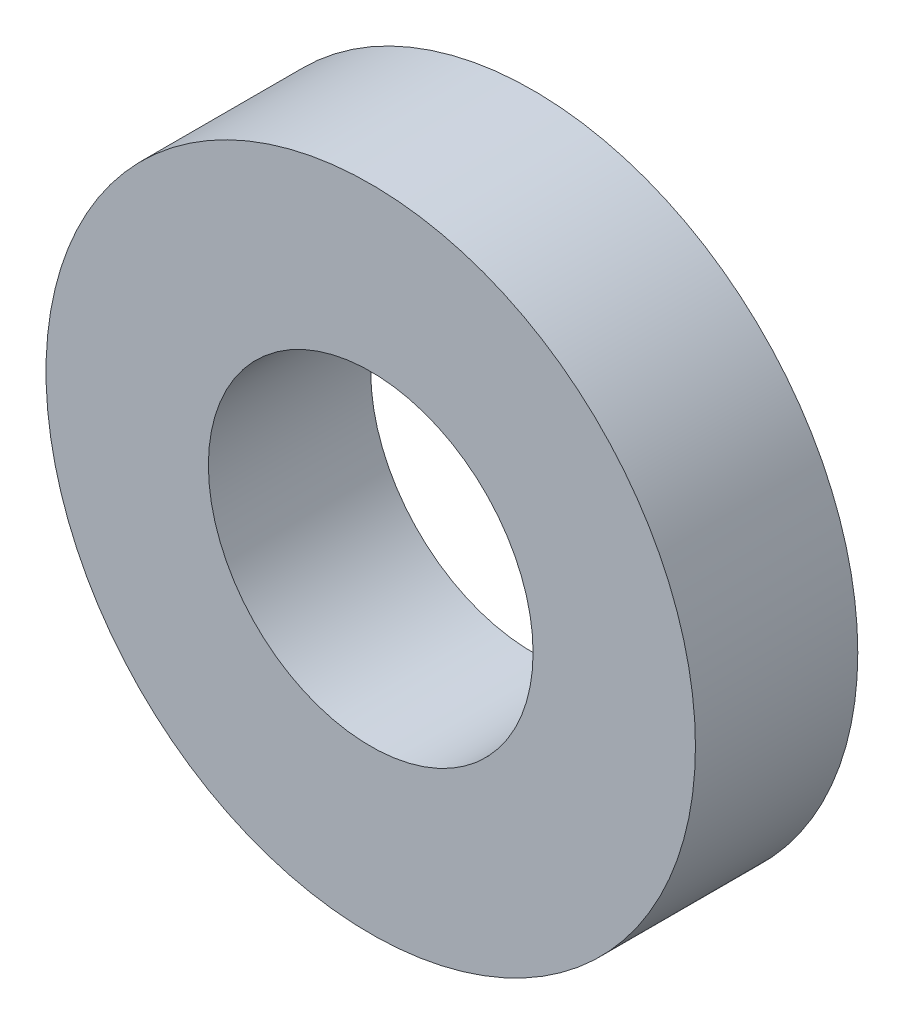
ISO-10303-21;
HEADER;
FILE_DESCRIPTION(('STEP AP214'),'2;1');
FILE_NAME('part.step','',(''),(''),'','','');
FILE_SCHEMA(('AUTOMOTIVE_DESIGN { 1 0 10303 214 1 1 1 1 }'));
ENDSEC;
DATA;
#1=APPLICATION_CONTEXT('core data for automotive mechanical design processes');
#2=APPLICATION_PROTOCOL_DEFINITION('international standard','automotive_design',2000,#1);
#3=PRODUCT_CONTEXT('',#1,'mechanical');
#4=PRODUCT('Part','Part','',(#3));
#5=PRODUCT_RELATED_PRODUCT_CATEGORY('part','',(#4));
#6=PRODUCT_DEFINITION_FORMATION('','',#4);
#7=PRODUCT_DEFINITION_CONTEXT('part definition',#1,'design');
#8=PRODUCT_DEFINITION('design','',#6,#7);
#9=PRODUCT_DEFINITION_SHAPE('','',#8);
#10=(LENGTH_UNIT() NAMED_UNIT(*) SI_UNIT(.MILLI.,.METRE.));
#11=(NAMED_UNIT(*) PLANE_ANGLE_UNIT() SI_UNIT($,.RADIAN.));
#12=(NAMED_UNIT(*) SI_UNIT($,.STERADIAN.) SOLID_ANGLE_UNIT());
#13=UNCERTAINTY_MEASURE_WITH_UNIT(LENGTH_MEASURE(1.E-05),#10,'distance_accuracy_value','');
#14=(GEOMETRIC_REPRESENTATION_CONTEXT(3) GLOBAL_UNCERTAINTY_ASSIGNED_CONTEXT((#13)) GLOBAL_UNIT_ASSIGNED_CONTEXT((#10,
#11,#12)) REPRESENTATION_CONTEXT('',''));
#15=CARTESIAN_POINT('',(0.,0.,0.));
#16=DIRECTION('',(0.,0.,1.));
#17=DIRECTION('',(1.,0.,0.));
#18=AXIS2_PLACEMENT_3D('',#15,#16,#17);
#19=CARTESIAN_POINT('',(0.,0.,2.54));
#20=DIRECTION('',(0.,0.,1.));
#21=DIRECTION('',(1.,0.,0.));
#22=AXIS2_PLACEMENT_3D('',#19,#20,#21);
#23=PLANE('',#22);
#24=CARTESIAN_POINT('',(0.,0.,2.54));
#25=DIRECTION('',(0.,0.,1.));
#26=DIRECTION('',(1.,0.,0.));
#27=AXIS2_PLACEMENT_3D('',#24,#25,#26);
#28=CIRCLE('',#27,5.08);
#29=CARTESIAN_POINT('',(5.08,0.,2.54));
#30=VERTEX_POINT('',#29);
#31=EDGE_CURVE('E10',#30,#30,#28,.T.);
#32=ORIENTED_EDGE('',*,*,#31,.T.);
#33=EDGE_LOOP('',(#32));
#34=FACE_BOUND('',#33,.T.);
#35=CARTESIAN_POINT('',(0.,0.,2.54));
#36=DIRECTION('',(0.,0.,1.));
#37=DIRECTION('',(1.,0.,0.));
#38=AXIS2_PLACEMENT_3D('',#35,#36,#37);
#39=CIRCLE('',#38,2.54);
#40=CARTESIAN_POINT('',(2.54,0.,2.54));
#41=VERTEX_POINT('',#40);
#42=EDGE_CURVE('E48',#41,#41,#39,.T.);
#43=ORIENTED_EDGE('',*,*,#42,.F.);
#44=EDGE_LOOP('',(#43));
#45=FACE_BOUND('',#44,.T.);
#46=ADVANCED_FACE('F35',(#34,#45),#23,.T.);
#47=CARTESIAN_POINT('',(0.,0.,0.));
#48=DIRECTION('',(0.,0.,1.));
#49=DIRECTION('',(1.,0.,0.));
#50=AXIS2_PLACEMENT_3D('',#47,#48,#49);
#51=PLANE('',#50);
#52=CARTESIAN_POINT('',(0.,0.,0.));
#53=DIRECTION('',(0.,0.,1.));
#54=DIRECTION('',(1.,0.,0.));
#55=AXIS2_PLACEMENT_3D('',#52,#53,#54);
#56=CIRCLE('',#55,5.08);
#57=CARTESIAN_POINT('',(5.08,0.,0.));
#58=VERTEX_POINT('',#57);
#59=EDGE_CURVE('E39',#58,#58,#56,.T.);
#60=ORIENTED_EDGE('',*,*,#59,.F.);
#61=EDGE_LOOP('',(#60));
#62=FACE_BOUND('',#61,.T.);
#63=CARTESIAN_POINT('',(0.,0.,0.));
#64=DIRECTION('',(0.,0.,1.));
#65=DIRECTION('',(1.,0.,0.));
#66=AXIS2_PLACEMENT_3D('',#63,#64,#65);
#67=CIRCLE('',#66,2.54);
#68=CARTESIAN_POINT('',(2.54,0.,0.));
#69=VERTEX_POINT('',#68);
#70=EDGE_CURVE('E50',#69,#69,#67,.T.);
#71=ORIENTED_EDGE('',*,*,#70,.T.);
#72=EDGE_LOOP('',(#71));
#73=FACE_BOUND('',#72,.T.);
#74=ADVANCED_FACE('F62',(#62,#73),#51,.F.);
#75=CARTESIAN_POINT('',(0.,0.,2.54));
#76=DIRECTION('',(0.,0.,-1.));
#77=DIRECTION('',(-1.,0.,0.));
#78=AXIS2_PLACEMENT_3D('',#75,#76,#77);
#79=CYLINDRICAL_SURFACE('',#78,5.08);
#80=ORIENTED_EDGE('',*,*,#31,.F.);
#81=EDGE_LOOP('',(#80));
#82=FACE_BOUND('',#81,.T.);
#83=ORIENTED_EDGE('',*,*,#59,.T.);
#84=EDGE_LOOP('',(#83));
#85=FACE_BOUND('',#84,.T.);
#86=ADVANCED_FACE('F37',(#82,#85),#79,.T.);
#87=CARTESIAN_POINT('',(0.,0.,2.54));
#88=DIRECTION('',(0.,0.,-1.));
#89=DIRECTION('',(-1.,0.,0.));
#90=AXIS2_PLACEMENT_3D('',#87,#88,#89);
#91=CYLINDRICAL_SURFACE('',#90,2.54);
#92=ORIENTED_EDGE('',*,*,#42,.T.);
#93=EDGE_LOOP('',(#92));
#94=FACE_BOUND('',#93,.T.);
#95=ORIENTED_EDGE('',*,*,#70,.F.);
#96=EDGE_LOOP('',(#95));
#97=FACE_BOUND('',#96,.T.);
#98=ADVANCED_FACE('F58',(#94,#97),#91,.F.);
#99=CLOSED_SHELL('',(#46,#74,#86,#98));
#100=MANIFOLD_SOLID_BREP('B2',#99);
#101=ADVANCED_BREP_SHAPE_REPRESENTATION('',(#18,#100),#14);
#102=SHAPE_DEFINITION_REPRESENTATION(#9,#101);
ENDSEC;
END-ISO-10303-21;
